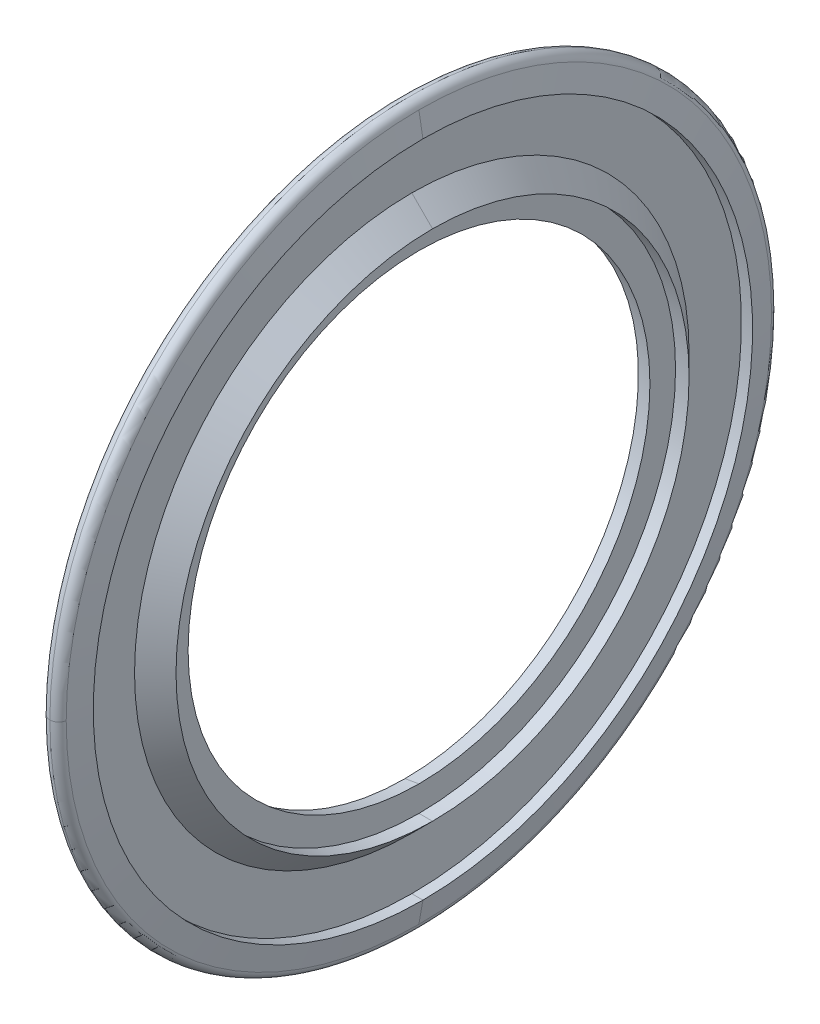
ISO-10303-21;
HEADER;
FILE_DESCRIPTION(('STEP AP214'),'2;1');
FILE_NAME('part.step','',(''),(''),'','','');
FILE_SCHEMA(('AUTOMOTIVE_DESIGN { 1 0 10303 214 1 1 1 1 }'));
ENDSEC;
DATA;
#1=APPLICATION_CONTEXT('core data for automotive mechanical design processes');
#2=APPLICATION_PROTOCOL_DEFINITION('international standard','automotive_design',2000,#1);
#3=PRODUCT_CONTEXT('',#1,'mechanical');
#4=PRODUCT('Part','Part','',(#3));
#5=PRODUCT_RELATED_PRODUCT_CATEGORY('part','',(#4));
#6=PRODUCT_DEFINITION_FORMATION('','',#4);
#7=PRODUCT_DEFINITION_CONTEXT('part definition',#1,'design');
#8=PRODUCT_DEFINITION('design','',#6,#7);
#9=PRODUCT_DEFINITION_SHAPE('','',#8);
#10=(LENGTH_UNIT() NAMED_UNIT(*) SI_UNIT(.MILLI.,.METRE.));
#11=(NAMED_UNIT(*) PLANE_ANGLE_UNIT() SI_UNIT($,.RADIAN.));
#12=(NAMED_UNIT(*) SI_UNIT($,.STERADIAN.) SOLID_ANGLE_UNIT());
#13=UNCERTAINTY_MEASURE_WITH_UNIT(LENGTH_MEASURE(1.E-05),#10,'distance_accuracy_value','');
#14=(GEOMETRIC_REPRESENTATION_CONTEXT(3) GLOBAL_UNCERTAINTY_ASSIGNED_CONTEXT((#13)) GLOBAL_UNIT_ASSIGNED_CONTEXT((#10,
#11,#12)) REPRESENTATION_CONTEXT('',''));
#15=CARTESIAN_POINT('',(0.,0.,0.));
#16=DIRECTION('',(0.,0.,1.));
#17=DIRECTION('',(1.,0.,0.));
#18=AXIS2_PLACEMENT_3D('',#15,#16,#17);
#19=CARTESIAN_POINT('',(0.717,0.,0.));
#20=DIRECTION('',(1.,0.,0.));
#21=DIRECTION('',(0.,0.,-1.));
#22=AXIS2_PLACEMENT_3D('',#19,#20,#21);
#23=TOROIDAL_SURFACE('',#22,18.613595,0.478);
#24=CARTESIAN_POINT('',(0.717,0.,0.));
#25=DIRECTION('',(1.,0.,0.));
#26=DIRECTION('',(0.,0.,-1.));
#27=AXIS2_PLACEMENT_3D('',#24,#25,#26);
#28=CIRCLE('',#27,19.091595);
#29=CARTESIAN_POINT('',(0.717,0.,19.091595));
#30=VERTEX_POINT('',#29);
#31=CARTESIAN_POINT('',(0.717,0.,-19.091595));
#32=VERTEX_POINT('',#31);
#33=EDGE_CURVE('E145',#30,#32,#28,.T.);
#34=ORIENTED_EDGE('',*,*,#33,.T.);
#35=CARTESIAN_POINT('',(0.717,0.,-18.613595));
#36=DIRECTION('',(0.,-1.,0.));
#37=DIRECTION('',(0.,0.,-1.));
#38=AXIS2_PLACEMENT_3D('',#35,#36,#37);
#39=CIRCLE('',#38,0.478);
#40=CARTESIAN_POINT('',(1.18773810593984,0.,-18.6965988289248));
#41=VERTEX_POINT('',#40);
#42=EDGE_CURVE('E142',#32,#41,#39,.T.);
#43=ORIENTED_EDGE('',*,*,#42,.T.);
#44=CARTESIAN_POINT('',(1.18773810593984,0.,0.));
#45=DIRECTION('',(1.,0.,0.));
#46=DIRECTION('',(0.,1.,0.));
#47=AXIS2_PLACEMENT_3D('',#44,#45,#46);
#48=CIRCLE('',#47,18.6965988289248);
#49=CARTESIAN_POINT('',(1.18773810593984,-18.6965988289248,0.));
#50=VERTEX_POINT('',#49);
#51=EDGE_CURVE('E32',#50,#41,#48,.T.);
#52=ORIENTED_EDGE('',*,*,#51,.F.);
#53=CARTESIAN_POINT('',(1.18773810593984,0.,0.));
#54=DIRECTION('',(1.,0.,0.));
#55=DIRECTION('',(0.,1.,0.));
#56=AXIS2_PLACEMENT_3D('',#53,#54,#55);
#57=CIRCLE('',#56,18.6965988289248);
#58=CARTESIAN_POINT('',(1.18773810593984,0.,18.6965988289248));
#59=VERTEX_POINT('',#58);
#60=EDGE_CURVE('E237',#59,#50,#57,.T.);
#61=ORIENTED_EDGE('',*,*,#60,.F.);
#62=CARTESIAN_POINT('',(0.717,0.,18.613595));
#63=DIRECTION('',(0.,-1.,0.));
#64=DIRECTION('',(0.,0.,1.));
#65=AXIS2_PLACEMENT_3D('',#62,#63,#64);
#66=CIRCLE('',#65,0.478);
#67=EDGE_CURVE('E156',#59,#30,#66,.T.);
#68=ORIENTED_EDGE('',*,*,#67,.T.);
#69=EDGE_LOOP('',(#34,#43,#52,#61,#68));
#70=FACE_BOUND('',#69,.T.);
#71=ADVANCED_FACE('F16',(#70),#23,.T.);
#72=CARTESIAN_POINT('',(0.303039856991038,18.470195,0.));
#73=DIRECTION('',(-1.,0.,0.));
#74=DIRECTION('',(0.,0.,1.));
#75=AXIS2_PLACEMENT_3D('',#72,#73,#74);
#76=PLANE('',#75);
#77=CARTESIAN_POINT('',(0.303039856991038,0.,0.));
#78=DIRECTION('',(1.,0.,0.));
#79=DIRECTION('',(0.,1.,0.));
#80=AXIS2_PLACEMENT_3D('',#77,#78,#79);
#81=CIRCLE('',#80,18.087795);
#82=CARTESIAN_POINT('',(0.303039856991038,18.087795,0.));
#83=VERTEX_POINT('',#82);
#84=CARTESIAN_POINT('',(0.303039856991038,-18.087795,0.));
#85=VERTEX_POINT('',#84);
#86=EDGE_CURVE('E137',#83,#85,#81,.T.);
#87=ORIENTED_EDGE('',*,*,#86,.T.);
#88=CARTESIAN_POINT('',(0.303039856991038,0.,0.));
#89=DIRECTION('',(1.,0.,0.));
#90=DIRECTION('',(0.,1.,0.));
#91=AXIS2_PLACEMENT_3D('',#88,#89,#90);
#92=CIRCLE('',#91,18.087795);
#93=EDGE_CURVE('E11',#85,#83,#92,.T.);
#94=ORIENTED_EDGE('',*,*,#93,.T.);
#95=EDGE_LOOP('',(#87,#94));
#96=FACE_BOUND('',#95,.T.);
#97=CARTESIAN_POINT('',(0.303039856991038,0.,0.));
#98=DIRECTION('',(1.,0.,0.));
#99=DIRECTION('',(0.,1.,0.));
#100=AXIS2_PLACEMENT_3D('',#97,#98,#99);
#101=CIRCLE('',#100,18.852595);
#102=CARTESIAN_POINT('',(0.303039856991038,0.,-18.852595));
#103=VERTEX_POINT('',#102);
#104=CARTESIAN_POINT('',(0.303039856991038,0.,18.852595));
#105=VERTEX_POINT('',#104);
#106=EDGE_CURVE('E154',#103,#105,#101,.T.);
#107=ORIENTED_EDGE('',*,*,#106,.F.);
#108=CARTESIAN_POINT('',(0.303039856991038,0.,0.));
#109=DIRECTION('',(1.,0.,0.));
#110=DIRECTION('',(0.,1.,0.));
#111=AXIS2_PLACEMENT_3D('',#108,#109,#110);
#112=CIRCLE('',#111,18.852595);
#113=EDGE_CURVE('E160',#105,#103,#112,.T.);
#114=ORIENTED_EDGE('',*,*,#113,.F.);
#115=EDGE_LOOP('',(#107,#114));
#116=FACE_BOUND('',#115,.T.);
#117=ADVANCED_FACE('F274',(#96,#116),#76,.T.);
#118=CARTESIAN_POINT('',(0.19931992849552,0.,0.));
#119=DIRECTION('',(1.,0.,0.));
#120=DIRECTION('',(0.,1.,0.));
#121=AXIS2_PLACEMENT_3D('',#118,#119,#120);
#122=CONICAL_SURFACE('',#121,17.9840750715045,0.785398163397439);
#123=DIRECTION('',(0.707106781186554,0.707106781186541,0.));
#124=VECTOR('',#123,1.);
#125=CARTESIAN_POINT('',(0.19931992849552,17.9840750715045,0.));
#126=LINE('',#125,#124);
#127=CARTESIAN_POINT('',(0.0956,17.880355143009,0.));
#128=VERTEX_POINT('',#127);
#129=EDGE_CURVE('E140',#128,#83,#126,.T.);
#130=ORIENTED_EDGE('',*,*,#129,.T.);
#131=ORIENTED_EDGE('',*,*,#93,.F.);
#132=DIRECTION('',(-0.707106781186554,0.707106781186541,0.));
#133=VECTOR('',#132,1.);
#134=CARTESIAN_POINT('',(0.19931992849552,-17.9840750715045,0.));
#135=LINE('',#134,#133);
#136=CARTESIAN_POINT('',(0.0956,-17.880355143009,0.));
#137=VERTEX_POINT('',#136);
#138=EDGE_CURVE('E132',#85,#137,#135,.T.);
#139=ORIENTED_EDGE('',*,*,#138,.T.);
#140=CARTESIAN_POINT('',(0.0956,0.,0.));
#141=DIRECTION('',(1.,0.,0.));
#142=DIRECTION('',(0.,1.,0.));
#143=AXIS2_PLACEMENT_3D('',#140,#141,#142);
#144=CIRCLE('',#143,17.880355143009);
#145=EDGE_CURVE('E24',#137,#128,#144,.T.);
#146=ORIENTED_EDGE('',*,*,#145,.T.);
#147=EDGE_LOOP('',(#130,#131,#139,#146));
#148=FACE_BOUND('',#147,.T.);
#149=ADVANCED_FACE('F133',(#148),#122,.T.);
#150=CARTESIAN_POINT('',(0.0956,15.7401775715045,0.));
#151=DIRECTION('',(-1.,0.,0.));
#152=DIRECTION('',(0.,0.,1.));
#153=AXIS2_PLACEMENT_3D('',#150,#151,#152);
#154=PLANE('',#153);
#155=CARTESIAN_POINT('',(0.0956,0.,0.));
#156=DIRECTION('',(1.,0.,0.));
#157=DIRECTION('',(0.,1.,0.));
#158=AXIS2_PLACEMENT_3D('',#155,#156,#157);
#159=CIRCLE('',#158,13.6);
#160=CARTESIAN_POINT('',(0.0956,13.6,0.));
#161=VERTEX_POINT('',#160);
#162=CARTESIAN_POINT('',(0.0956,-13.6,0.));
#163=VERTEX_POINT('',#162);
#164=EDGE_CURVE('E19',#161,#163,#159,.T.);
#165=ORIENTED_EDGE('',*,*,#164,.T.);
#166=CARTESIAN_POINT('',(0.0956,0.,0.));
#167=DIRECTION('',(1.,0.,0.));
#168=DIRECTION('',(0.,1.,0.));
#169=AXIS2_PLACEMENT_3D('',#166,#167,#168);
#170=CIRCLE('',#169,13.6);
#171=EDGE_CURVE('E167',#163,#161,#170,.T.);
#172=ORIENTED_EDGE('',*,*,#171,.T.);
#173=EDGE_LOOP('',(#165,#172));
#174=FACE_BOUND('',#173,.T.);
#175=CARTESIAN_POINT('',(0.0956,0.,0.));
#176=DIRECTION('',(1.,0.,0.));
#177=DIRECTION('',(0.,1.,0.));
#178=AXIS2_PLACEMENT_3D('',#175,#176,#177);
#179=CIRCLE('',#178,17.880355143009);
#180=EDGE_CURVE('E126',#128,#137,#179,.T.);
#181=ORIENTED_EDGE('',*,*,#180,.F.);
#182=ORIENTED_EDGE('',*,*,#145,.F.);
#183=EDGE_LOOP('',(#181,#182));
#184=FACE_BOUND('',#183,.T.);
#185=ADVANCED_FACE('F124',(#174,#184),#154,.T.);
#186=CARTESIAN_POINT('',(0.27485,0.,0.));
#187=DIRECTION('',(1.,0.,0.));
#188=DIRECTION('',(0.,1.,0.));
#189=AXIS2_PLACEMENT_3D('',#186,#187,#188);
#190=CYLINDRICAL_SURFACE('',#189,13.6);
#191=DIRECTION('',(1.,0.,0.));
#192=VECTOR('',#191,1.);
#193=CARTESIAN_POINT('',(0.27485,13.6,0.));
#194=LINE('',#193,#192);
#195=CARTESIAN_POINT('',(0.4541,13.6,0.));
#196=VERTEX_POINT('',#195);
#197=EDGE_CURVE('E164',#161,#196,#194,.T.);
#198=ORIENTED_EDGE('',*,*,#197,.T.);
#199=CARTESIAN_POINT('',(0.4541,0.,0.));
#200=DIRECTION('',(1.,0.,0.));
#201=DIRECTION('',(0.,1.,0.));
#202=AXIS2_PLACEMENT_3D('',#199,#200,#201);
#203=CIRCLE('',#202,13.6);
#204=CARTESIAN_POINT('',(0.4541,-13.6,0.));
#205=VERTEX_POINT('',#204);
#206=EDGE_CURVE('E248',#196,#205,#203,.T.);
#207=ORIENTED_EDGE('',*,*,#206,.T.);
#208=DIRECTION('',(-1.,0.,0.));
#209=VECTOR('',#208,1.);
#210=CARTESIAN_POINT('',(0.27485,-13.6,0.));
#211=LINE('',#210,#209);
#212=EDGE_CURVE('E176',#205,#163,#211,.T.);
#213=ORIENTED_EDGE('',*,*,#212,.T.);
#214=ORIENTED_EDGE('',*,*,#164,.F.);
#215=EDGE_LOOP('',(#198,#207,#213,#214));
#216=FACE_BOUND('',#215,.T.);
#217=ADVANCED_FACE('F255',(#216),#190,.F.);
#218=CARTESIAN_POINT('',(0.4541,12.9863184155411,0.));
#219=DIRECTION('',(-1.,0.,0.));
#220=DIRECTION('',(0.,1.,0.));
#221=AXIS2_PLACEMENT_3D('',#218,#219,#220);
#222=PLANE('',#221);
#223=CARTESIAN_POINT('',(0.4541,0.,0.));
#224=DIRECTION('',(1.,0.,0.));
#225=DIRECTION('',(0.,1.,0.));
#226=AXIS2_PLACEMENT_3D('',#223,#224,#225);
#227=CIRCLE('',#226,12.3726368310821);
#228=CARTESIAN_POINT('',(0.4541,12.3726368310821,0.));
#229=VERTEX_POINT('',#228);
#230=CARTESIAN_POINT('',(0.4541,-12.3726368310821,0.));
#231=VERTEX_POINT('',#230);
#232=EDGE_CURVE('E247',#229,#231,#227,.T.);
#233=ORIENTED_EDGE('',*,*,#232,.T.);
#234=CARTESIAN_POINT('',(0.4541,0.,0.));
#235=DIRECTION('',(1.,0.,0.));
#236=DIRECTION('',(0.,1.,0.));
#237=AXIS2_PLACEMENT_3D('',#234,#235,#236);
#238=CIRCLE('',#237,12.3726368310821);
#239=EDGE_CURVE('E201',#231,#229,#238,.T.);
#240=ORIENTED_EDGE('',*,*,#239,.T.);
#241=EDGE_LOOP('',(#233,#240));
#242=FACE_BOUND('',#241,.T.);
#243=ORIENTED_EDGE('',*,*,#206,.F.);
#244=CARTESIAN_POINT('',(0.4541,0.,0.));
#245=DIRECTION('',(1.,0.,0.));
#246=DIRECTION('',(0.,1.,0.));
#247=AXIS2_PLACEMENT_3D('',#244,#245,#246);
#248=CIRCLE('',#247,13.6);
#249=EDGE_CURVE('E195',#205,#196,#248,.T.);
#250=ORIENTED_EDGE('',*,*,#249,.F.);
#251=EDGE_LOOP('',(#243,#250));
#252=FACE_BOUND('',#251,.T.);
#253=ADVANCED_FACE('F259',(#242,#252),#222,.T.);
#254=CARTESIAN_POINT('',(0.82455,0.,0.));
#255=DIRECTION('',(-1.,0.,0.));
#256=DIRECTION('',(0.,1.,0.));
#257=AXIS2_PLACEMENT_3D('',#254,#255,#256);
#258=CONICAL_SURFACE('',#257,12.3073165010787,0.174532925199431);
#259=DIRECTION('',(0.984807753012208,-0.173648177666929,0.));
#260=VECTOR('',#259,1.);
#261=CARTESIAN_POINT('',(0.82455,12.3073165010787,0.));
#262=LINE('',#261,#260);
#263=CARTESIAN_POINT('',(1.195,12.2419961710752,0.));
#264=VERTEX_POINT('',#263);
#265=EDGE_CURVE('E198',#229,#264,#262,.T.);
#266=ORIENTED_EDGE('',*,*,#265,.T.);
#267=CARTESIAN_POINT('',(1.195,0.,0.));
#268=DIRECTION('',(1.,0.,0.));
#269=DIRECTION('',(0.,1.,0.));
#270=AXIS2_PLACEMENT_3D('',#267,#268,#269);
#271=CIRCLE('',#270,12.2419961710752);
#272=CARTESIAN_POINT('',(1.195,-12.2419961710752,0.));
#273=VERTEX_POINT('',#272);
#274=EDGE_CURVE('E245',#264,#273,#271,.T.);
#275=ORIENTED_EDGE('',*,*,#274,.T.);
#276=DIRECTION('',(-0.984807753012208,-0.173648177666929,0.));
#277=VECTOR('',#276,1.);
#278=CARTESIAN_POINT('',(0.82455,-12.3073165010787,0.));
#279=LINE('',#278,#277);
#280=EDGE_CURVE('E204',#273,#231,#279,.T.);
#281=ORIENTED_EDGE('',*,*,#280,.T.);
#282=ORIENTED_EDGE('',*,*,#232,.F.);
#283=EDGE_LOOP('',(#266,#275,#281,#282));
#284=FACE_BOUND('',#283,.T.);
#285=ADVANCED_FACE('F261',(#284),#258,.F.);
#286=CARTESIAN_POINT('',(1.195,12.9209980855376,0.));
#287=DIRECTION('',(1.,0.,0.));
#288=DIRECTION('',(0.,1.,0.));
#289=AXIS2_PLACEMENT_3D('',#286,#287,#288);
#290=PLANE('',#289);
#291=ORIENTED_EDGE('',*,*,#274,.F.);
#292=CARTESIAN_POINT('',(1.195,0.,0.));
#293=DIRECTION('',(1.,0.,0.));
#294=DIRECTION('',(0.,1.,0.));
#295=AXIS2_PLACEMENT_3D('',#292,#293,#294);
#296=CIRCLE('',#295,12.2419961710752);
#297=EDGE_CURVE('E206',#273,#264,#296,.T.);
#298=ORIENTED_EDGE('',*,*,#297,.F.);
#299=EDGE_LOOP('',(#291,#298));
#300=FACE_BOUND('',#299,.T.);
#301=CARTESIAN_POINT('',(1.195,0.,0.));
#302=DIRECTION('',(1.,0.,0.));
#303=DIRECTION('',(0.,1.,0.));
#304=AXIS2_PLACEMENT_3D('',#301,#302,#303);
#305=CIRCLE('',#304,13.6);
#306=CARTESIAN_POINT('',(1.195,13.6,0.));
#307=VERTEX_POINT('',#306);
#308=CARTESIAN_POINT('',(1.195,-13.6,0.));
#309=VERTEX_POINT('',#308);
#310=EDGE_CURVE('E186',#307,#309,#305,.T.);
#311=ORIENTED_EDGE('',*,*,#310,.T.);
#312=CARTESIAN_POINT('',(1.195,0.,0.));
#313=DIRECTION('',(1.,0.,0.));
#314=DIRECTION('',(0.,1.,0.));
#315=AXIS2_PLACEMENT_3D('',#312,#313,#314);
#316=CIRCLE('',#315,13.6);
#317=EDGE_CURVE('E213',#309,#307,#316,.T.);
#318=ORIENTED_EDGE('',*,*,#317,.T.);
#319=EDGE_LOOP('',(#311,#318));
#320=FACE_BOUND('',#319,.T.);
#321=ADVANCED_FACE('F269',(#300,#320),#290,.T.);
#322=CARTESIAN_POINT('',(1.5535,0.,0.));
#323=DIRECTION('',(1.,0.,0.));
#324=DIRECTION('',(0.,1.,0.));
#325=AXIS2_PLACEMENT_3D('',#322,#323,#324);
#326=CYLINDRICAL_SURFACE('',#325,13.6);
#327=DIRECTION('',(1.,0.,0.));
#328=VECTOR('',#327,1.);
#329=CARTESIAN_POINT('',(1.5535,13.6,0.));
#330=LINE('',#329,#328);
#331=CARTESIAN_POINT('',(1.912,13.6,0.));
#332=VERTEX_POINT('',#331);
#333=EDGE_CURVE('E210',#307,#332,#330,.T.);
#334=ORIENTED_EDGE('',*,*,#333,.T.);
#335=CARTESIAN_POINT('',(1.912,0.,0.));
#336=DIRECTION('',(1.,0.,0.));
#337=DIRECTION('',(0.,1.,0.));
#338=AXIS2_PLACEMENT_3D('',#335,#336,#337);
#339=CIRCLE('',#338,13.6);
#340=CARTESIAN_POINT('',(1.912,-13.6,0.));
#341=VERTEX_POINT('',#340);
#342=EDGE_CURVE('E231',#332,#341,#339,.T.);
#343=ORIENTED_EDGE('',*,*,#342,.T.);
#344=DIRECTION('',(-1.,0.,0.));
#345=VECTOR('',#344,1.);
#346=CARTESIAN_POINT('',(1.5535,-13.6,0.));
#347=LINE('',#346,#345);
#348=EDGE_CURVE('E216',#341,#309,#347,.T.);
#349=ORIENTED_EDGE('',*,*,#348,.T.);
#350=ORIENTED_EDGE('',*,*,#310,.F.);
#351=EDGE_LOOP('',(#334,#343,#349,#350));
#352=FACE_BOUND('',#351,.T.);
#353=ADVANCED_FACE('F313',(#352),#326,.F.);
#354=CARTESIAN_POINT('',(1.3623,0.,0.));
#355=DIRECTION('',(-1.,0.,0.));
#356=DIRECTION('',(0.,1.,0.));
#357=AXIS2_PLACEMENT_3D('',#354,#355,#356);
#358=CONICAL_SURFACE('',#357,14.1497,0.785398163397448);
#359=DIRECTION('',(0.707106781186548,-0.707106781186547,0.));
#360=VECTOR('',#359,1.);
#361=CARTESIAN_POINT('',(1.3623,14.1497,0.));
#362=LINE('',#361,#360);
#363=CARTESIAN_POINT('',(0.8126,14.6994,0.));
#364=VERTEX_POINT('',#363);
#365=EDGE_CURVE('E222',#364,#332,#362,.T.);
#366=ORIENTED_EDGE('',*,*,#365,.T.);
#367=CARTESIAN_POINT('',(1.912,0.,0.));
#368=DIRECTION('',(1.,0.,0.));
#369=DIRECTION('',(0.,1.,0.));
#370=AXIS2_PLACEMENT_3D('',#367,#368,#369);
#371=CIRCLE('',#370,13.6);
#372=EDGE_CURVE('E219',#341,#332,#371,.T.);
#373=ORIENTED_EDGE('',*,*,#372,.F.);
#374=DIRECTION('',(-0.707106781186548,-0.707106781186547,0.));
#375=VECTOR('',#374,1.);
#376=CARTESIAN_POINT('',(1.3623,-14.1497,0.));
#377=LINE('',#376,#375);
#378=CARTESIAN_POINT('',(0.8126,-14.6994,0.));
#379=VERTEX_POINT('',#378);
#380=EDGE_CURVE('E228',#341,#379,#377,.T.);
#381=ORIENTED_EDGE('',*,*,#380,.T.);
#382=CARTESIAN_POINT('',(0.8126,0.,0.));
#383=DIRECTION('',(1.,0.,0.));
#384=DIRECTION('',(0.,1.,0.));
#385=AXIS2_PLACEMENT_3D('',#382,#383,#384);
#386=CIRCLE('',#385,14.6994);
#387=EDGE_CURVE('E184',#379,#364,#386,.T.);
#388=ORIENTED_EDGE('',*,*,#387,.T.);
#389=EDGE_LOOP('',(#366,#373,#381,#388));
#390=FACE_BOUND('',#389,.T.);
#391=ADVANCED_FACE('F315',(#390),#358,.T.);
#392=CARTESIAN_POINT('',(0.8126,16.0877,0.));
#393=DIRECTION('',(1.,0.,0.));
#394=DIRECTION('',(0.,1.,0.));
#395=AXIS2_PLACEMENT_3D('',#392,#393,#394);
#396=PLANE('',#395);
#397=CARTESIAN_POINT('',(0.8126,0.,0.));
#398=DIRECTION('',(1.,0.,0.));
#399=DIRECTION('',(0.,1.,0.));
#400=AXIS2_PLACEMENT_3D('',#397,#398,#399);
#401=CIRCLE('',#400,14.6994);
#402=EDGE_CURVE('E225',#364,#379,#401,.T.);
#403=ORIENTED_EDGE('',*,*,#402,.F.);
#404=ORIENTED_EDGE('',*,*,#387,.F.);
#405=EDGE_LOOP('',(#403,#404));
#406=FACE_BOUND('',#405,.T.);
#407=CARTESIAN_POINT('',(0.8126,0.,0.));
#408=DIRECTION('',(1.,0.,0.));
#409=DIRECTION('',(0.,1.,0.));
#410=AXIS2_PLACEMENT_3D('',#407,#408,#409);
#411=CIRCLE('',#410,17.476);
#412=CARTESIAN_POINT('',(0.8126,17.476,0.));
#413=VERTEX_POINT('',#412);
#414=CARTESIAN_POINT('',(0.8126,-17.476,0.));
#415=VERTEX_POINT('',#414);
#416=EDGE_CURVE('E187',#413,#415,#411,.T.);
#417=ORIENTED_EDGE('',*,*,#416,.T.);
#418=CARTESIAN_POINT('',(0.8126,0.,0.));
#419=DIRECTION('',(1.,0.,0.));
#420=DIRECTION('',(0.,1.,0.));
#421=AXIS2_PLACEMENT_3D('',#418,#419,#420);
#422=CIRCLE('',#421,17.476);
#423=EDGE_CURVE('E168',#415,#413,#422,.T.);
#424=ORIENTED_EDGE('',*,*,#423,.T.);
#425=EDGE_LOOP('',(#417,#424));
#426=FACE_BOUND('',#425,.T.);
#427=ADVANCED_FACE('F321',(#406,#426),#396,.T.);
#428=CARTESIAN_POINT('',(1.10778130605022,0.,0.));
#429=DIRECTION('',(1.,0.,0.));
#430=DIRECTION('',(0.,1.,0.));
#431=AXIS2_PLACEMENT_3D('',#428,#429,#430);
#432=CYLINDRICAL_SURFACE('',#431,17.476);
#433=DIRECTION('',(1.,0.,0.));
#434=VECTOR('',#433,1.);
#435=CARTESIAN_POINT('',(1.10778130605022,17.476,0.));
#436=LINE('',#435,#434);
#437=CARTESIAN_POINT('',(1.40296261210043,17.476,0.));
#438=VERTEX_POINT('',#437);
#439=EDGE_CURVE('E171',#413,#438,#436,.T.);
#440=ORIENTED_EDGE('',*,*,#439,.T.);
#441=CARTESIAN_POINT('',(1.40296261210043,0.,0.));
#442=DIRECTION('',(1.,0.,0.));
#443=DIRECTION('',(0.,1.,0.));
#444=AXIS2_PLACEMENT_3D('',#441,#442,#443);
#445=CIRCLE('',#444,17.476);
#446=CARTESIAN_POINT('',(1.40296261210043,-17.476,0.));
#447=VERTEX_POINT('',#446);
#448=EDGE_CURVE('E40',#438,#447,#445,.T.);
#449=ORIENTED_EDGE('',*,*,#448,.T.);
#450=DIRECTION('',(-1.,0.,0.));
#451=VECTOR('',#450,1.);
#452=CARTESIAN_POINT('',(1.10778130605022,-17.476,0.));
#453=LINE('',#452,#451);
#454=EDGE_CURVE('E153',#447,#415,#453,.T.);
#455=ORIENTED_EDGE('',*,*,#454,.T.);
#456=ORIENTED_EDGE('',*,*,#416,.F.);
#457=EDGE_LOOP('',(#440,#449,#455,#456));
#458=FACE_BOUND('',#457,.T.);
#459=ADVANCED_FACE('F309',(#458),#432,.F.);
#460=CARTESIAN_POINT('',(1.29535035902013,0.,0.));
#461=DIRECTION('',(-1.,0.,0.));
#462=DIRECTION('',(0.,1.,0.));
#463=AXIS2_PLACEMENT_3D('',#460,#461,#462);
#464=CONICAL_SURFACE('',#463,18.0862994144624,1.39626340159546);
#465=DIRECTION('',(0.173648177666931,-0.984807753012208,0.));
#466=VECTOR('',#465,1.);
#467=CARTESIAN_POINT('',(1.29535035902013,18.0862994144624,0.));
#468=LINE('',#467,#466);
#469=CARTESIAN_POINT('',(1.18773810593984,18.6965988289248,0.));
#470=VERTEX_POINT('',#469);
#471=EDGE_CURVE('E152',#470,#438,#468,.T.);
#472=ORIENTED_EDGE('',*,*,#471,.T.);
#473=CARTESIAN_POINT('',(1.40296261210043,0.,0.));
#474=DIRECTION('',(1.,0.,0.));
#475=DIRECTION('',(0.,1.,0.));
#476=AXIS2_PLACEMENT_3D('',#473,#474,#475);
#477=CIRCLE('',#476,17.476);
#478=EDGE_CURVE('E149',#447,#438,#477,.T.);
#479=ORIENTED_EDGE('',*,*,#478,.F.);
#480=DIRECTION('',(-0.173648177666931,-0.984807753012208,0.));
#481=VECTOR('',#480,1.);
#482=CARTESIAN_POINT('',(1.29535035902013,-18.0862994144624,0.));
#483=LINE('',#482,#481);
#484=EDGE_CURVE('E240',#447,#50,#483,.T.);
#485=ORIENTED_EDGE('',*,*,#484,.T.);
#486=ORIENTED_EDGE('',*,*,#51,.T.);
#487=CARTESIAN_POINT('',(1.18773810593984,0.,0.));
#488=DIRECTION('',(1.,0.,0.));
#489=DIRECTION('',(0.,1.,0.));
#490=AXIS2_PLACEMENT_3D('',#487,#488,#489);
#491=CIRCLE('',#490,18.6965988289248);
#492=EDGE_CURVE('E177',#41,#470,#491,.T.);
#493=ORIENTED_EDGE('',*,*,#492,.T.);
#494=EDGE_LOOP('',(#472,#479,#485,#486,#493));
#495=FACE_BOUND('',#494,.T.);
#496=ADVANCED_FACE('F294',(#495),#464,.T.);
#497=CARTESIAN_POINT('',(1.29535035902013,0.,0.));
#498=DIRECTION('',(-1.,0.,0.));
#499=DIRECTION('',(0.,1.,0.));
#500=AXIS2_PLACEMENT_3D('',#497,#498,#499);
#501=CONICAL_SURFACE('',#500,18.0862994144624,1.39626340159546);
#502=ORIENTED_EDGE('',*,*,#471,.F.);
#503=CARTESIAN_POINT('',(1.18773810593984,0.,0.));
#504=DIRECTION('',(1.,0.,0.));
#505=DIRECTION('',(0.,1.,0.));
#506=AXIS2_PLACEMENT_3D('',#503,#504,#505);
#507=CIRCLE('',#506,18.6965988289248);
#508=EDGE_CURVE('E180',#470,#59,#507,.T.);
#509=ORIENTED_EDGE('',*,*,#508,.T.);
#510=ORIENTED_EDGE('',*,*,#60,.T.);
#511=ORIENTED_EDGE('',*,*,#484,.F.);
#512=ORIENTED_EDGE('',*,*,#448,.F.);
#513=EDGE_LOOP('',(#502,#509,#510,#511,#512));
#514=FACE_BOUND('',#513,.T.);
#515=ADVANCED_FACE('F298',(#514),#501,.T.);
#516=CARTESIAN_POINT('',(1.10778130605022,0.,0.));
#517=DIRECTION('',(1.,0.,0.));
#518=DIRECTION('',(0.,1.,0.));
#519=AXIS2_PLACEMENT_3D('',#516,#517,#518);
#520=CYLINDRICAL_SURFACE('',#519,17.476);
#521=ORIENTED_EDGE('',*,*,#439,.F.);
#522=ORIENTED_EDGE('',*,*,#423,.F.);
#523=ORIENTED_EDGE('',*,*,#454,.F.);
#524=ORIENTED_EDGE('',*,*,#478,.T.);
#525=EDGE_LOOP('',(#521,#522,#523,#524));
#526=FACE_BOUND('',#525,.T.);
#527=ADVANCED_FACE('F300',(#526),#520,.F.);
#528=CARTESIAN_POINT('',(1.3623,0.,0.));
#529=DIRECTION('',(-1.,0.,0.));
#530=DIRECTION('',(0.,1.,0.));
#531=AXIS2_PLACEMENT_3D('',#528,#529,#530);
#532=CONICAL_SURFACE('',#531,14.1497,0.785398163397448);
#533=ORIENTED_EDGE('',*,*,#365,.F.);
#534=ORIENTED_EDGE('',*,*,#402,.T.);
#535=ORIENTED_EDGE('',*,*,#380,.F.);
#536=ORIENTED_EDGE('',*,*,#342,.F.);
#537=EDGE_LOOP('',(#533,#534,#535,#536));
#538=FACE_BOUND('',#537,.T.);
#539=ADVANCED_FACE('F306',(#538),#532,.T.);
#540=CARTESIAN_POINT('',(1.5535,0.,0.));
#541=DIRECTION('',(1.,0.,0.));
#542=DIRECTION('',(0.,1.,0.));
#543=AXIS2_PLACEMENT_3D('',#540,#541,#542);
#544=CYLINDRICAL_SURFACE('',#543,13.6);
#545=ORIENTED_EDGE('',*,*,#333,.F.);
#546=ORIENTED_EDGE('',*,*,#317,.F.);
#547=ORIENTED_EDGE('',*,*,#348,.F.);
#548=ORIENTED_EDGE('',*,*,#372,.T.);
#549=EDGE_LOOP('',(#545,#546,#547,#548));
#550=FACE_BOUND('',#549,.T.);
#551=ADVANCED_FACE('F330',(#550),#544,.F.);
#552=CARTESIAN_POINT('',(0.82455,0.,0.));
#553=DIRECTION('',(-1.,0.,0.));
#554=DIRECTION('',(0.,1.,0.));
#555=AXIS2_PLACEMENT_3D('',#552,#553,#554);
#556=CONICAL_SURFACE('',#555,12.3073165010787,0.174532925199431);
#557=ORIENTED_EDGE('',*,*,#265,.F.);
#558=ORIENTED_EDGE('',*,*,#239,.F.);
#559=ORIENTED_EDGE('',*,*,#280,.F.);
#560=ORIENTED_EDGE('',*,*,#297,.T.);
#561=EDGE_LOOP('',(#557,#558,#559,#560));
#562=FACE_BOUND('',#561,.T.);
#563=ADVANCED_FACE('F354',(#562),#556,.F.);
#564=CARTESIAN_POINT('',(0.27485,0.,0.));
#565=DIRECTION('',(1.,0.,0.));
#566=DIRECTION('',(0.,1.,0.));
#567=AXIS2_PLACEMENT_3D('',#564,#565,#566);
#568=CYLINDRICAL_SURFACE('',#567,13.6);
#569=ORIENTED_EDGE('',*,*,#197,.F.);
#570=ORIENTED_EDGE('',*,*,#171,.F.);
#571=ORIENTED_EDGE('',*,*,#212,.F.);
#572=ORIENTED_EDGE('',*,*,#249,.T.);
#573=EDGE_LOOP('',(#569,#570,#571,#572));
#574=FACE_BOUND('',#573,.T.);
#575=ADVANCED_FACE('F257',(#574),#568,.F.);
#576=CARTESIAN_POINT('',(0.19931992849552,0.,0.));
#577=DIRECTION('',(1.,0.,0.));
#578=DIRECTION('',(0.,1.,0.));
#579=AXIS2_PLACEMENT_3D('',#576,#577,#578);
#580=CONICAL_SURFACE('',#579,17.9840750715045,0.785398163397439);
#581=ORIENTED_EDGE('',*,*,#129,.F.);
#582=ORIENTED_EDGE('',*,*,#180,.T.);
#583=ORIENTED_EDGE('',*,*,#138,.F.);
#584=ORIENTED_EDGE('',*,*,#86,.F.);
#585=EDGE_LOOP('',(#581,#582,#583,#584));
#586=FACE_BOUND('',#585,.T.);
#587=ADVANCED_FACE('F139',(#586),#580,.T.);
#588=CARTESIAN_POINT('',(0.717,0.,0.));
#589=DIRECTION('',(1.,0.,0.));
#590=DIRECTION('',(0.,0.,-1.));
#591=AXIS2_PLACEMENT_3D('',#588,#589,#590);
#592=TOROIDAL_SURFACE('',#591,18.613595,0.478);
#593=CARTESIAN_POINT('',(0.717,0.,0.));
#594=DIRECTION('',(1.,0.,0.));
#595=DIRECTION('',(0.,0.,-1.));
#596=AXIS2_PLACEMENT_3D('',#593,#594,#595);
#597=CIRCLE('',#596,19.091595);
#598=EDGE_CURVE('E157',#32,#30,#597,.T.);
#599=ORIENTED_EDGE('',*,*,#598,.T.);
#600=ORIENTED_EDGE('',*,*,#67,.F.);
#601=ORIENTED_EDGE('',*,*,#508,.F.);
#602=ORIENTED_EDGE('',*,*,#492,.F.);
#603=ORIENTED_EDGE('',*,*,#42,.F.);
#604=EDGE_LOOP('',(#599,#600,#601,#602,#603));
#605=FACE_BOUND('',#604,.T.);
#606=ADVANCED_FACE('F291',(#605),#592,.T.);
#607=CARTESIAN_POINT('',(0.717,0.,0.));
#608=DIRECTION('',(1.,0.,0.));
#609=DIRECTION('',(0.,0.,-1.));
#610=AXIS2_PLACEMENT_3D('',#607,#608,#609);
#611=TOROIDAL_SURFACE('',#610,18.613595,0.478);
#612=ORIENTED_EDGE('',*,*,#598,.F.);
#613=CARTESIAN_POINT('',(0.717,0.,-18.613595));
#614=DIRECTION('',(0.,-1.,0.));
#615=DIRECTION('',(0.,0.,-1.));
#616=AXIS2_PLACEMENT_3D('',#613,#614,#615);
#617=CIRCLE('',#616,0.478);
#618=EDGE_CURVE('E163',#103,#32,#617,.T.);
#619=ORIENTED_EDGE('',*,*,#618,.F.);
#620=ORIENTED_EDGE('',*,*,#106,.T.);
#621=CARTESIAN_POINT('',(0.717,0.,18.613595));
#622=DIRECTION('',(0.,-1.,0.));
#623=DIRECTION('',(0.,0.,1.));
#624=AXIS2_PLACEMENT_3D('',#621,#622,#623);
#625=CIRCLE('',#624,0.478);
#626=EDGE_CURVE('E148',#30,#105,#625,.T.);
#627=ORIENTED_EDGE('',*,*,#626,.F.);
#628=EDGE_LOOP('',(#612,#619,#620,#627));
#629=FACE_BOUND('',#628,.T.);
#630=ADVANCED_FACE('F289',(#629),#611,.T.);
#631=CARTESIAN_POINT('',(0.717,0.,0.));
#632=DIRECTION('',(1.,0.,0.));
#633=DIRECTION('',(0.,0.,-1.));
#634=AXIS2_PLACEMENT_3D('',#631,#632,#633);
#635=TOROIDAL_SURFACE('',#634,18.613595,0.478);
#636=ORIENTED_EDGE('',*,*,#33,.F.);
#637=ORIENTED_EDGE('',*,*,#626,.T.);
#638=ORIENTED_EDGE('',*,*,#113,.T.);
#639=ORIENTED_EDGE('',*,*,#618,.T.);
#640=EDGE_LOOP('',(#636,#637,#638,#639));
#641=FACE_BOUND('',#640,.T.);
#642=ADVANCED_FACE('F283',(#641),#635,.T.);
#643=CLOSED_SHELL('',(#71,#117,#149,#185,#217,#253,#285,#321,#353,#391,#427,#459,#496,#515,#527,
#539,#551,#563,#575,#587,#606,#630,#642));
#644=MANIFOLD_SOLID_BREP('B1',#643);
#645=ADVANCED_BREP_SHAPE_REPRESENTATION('',(#18,#644),#14);
#646=SHAPE_DEFINITION_REPRESENTATION(#9,#645);
ENDSEC;
END-ISO-10303-21;
